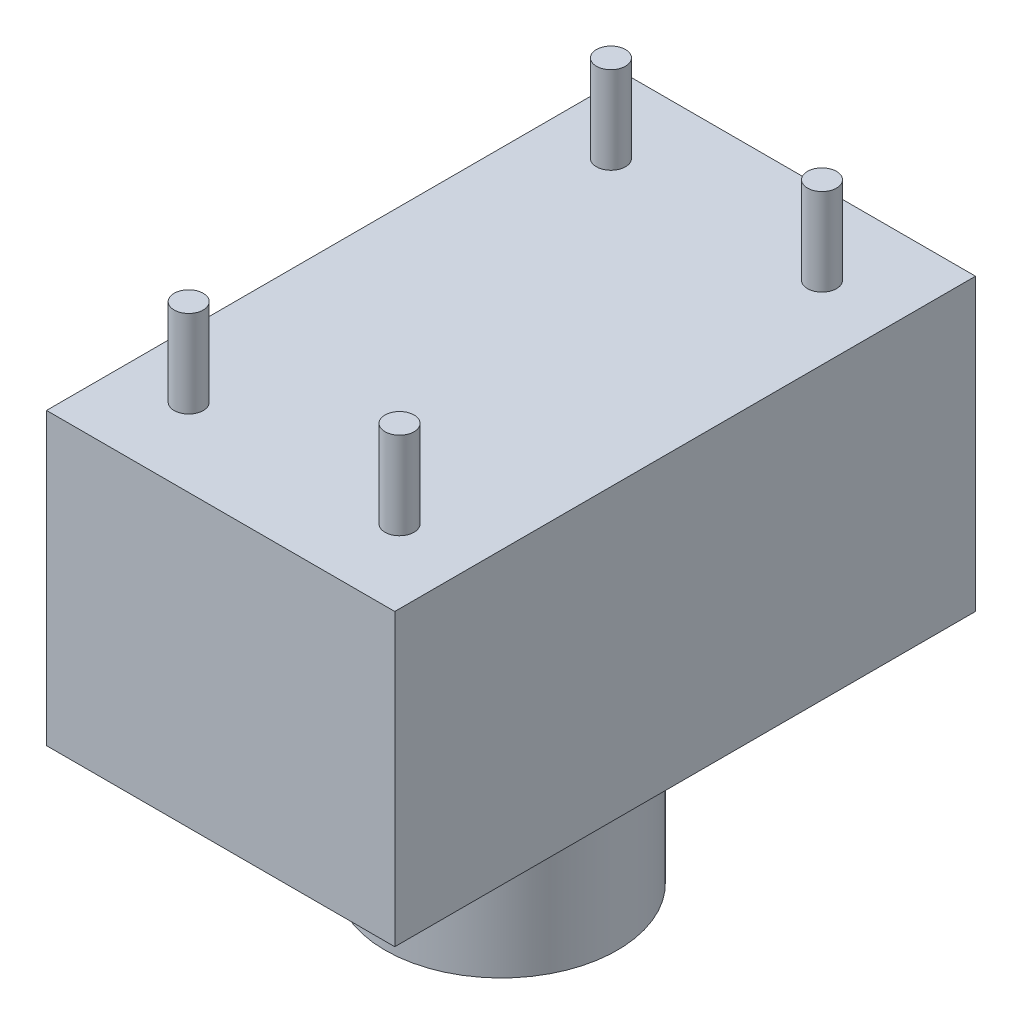
ISO-10303-21;
HEADER;
FILE_DESCRIPTION(('STEP AP214'),'2;1');
FILE_NAME('part.step','',(''),(''),'','','');
FILE_SCHEMA(('AUTOMOTIVE_DESIGN { 1 0 10303 214 1 1 1 1 }'));
ENDSEC;
DATA;
#1=APPLICATION_CONTEXT('core data for automotive mechanical design processes');
#2=APPLICATION_PROTOCOL_DEFINITION('international standard','automotive_design',2000,#1);
#3=PRODUCT_CONTEXT('',#1,'mechanical');
#4=PRODUCT('Part','Part','',(#3));
#5=PRODUCT_RELATED_PRODUCT_CATEGORY('part','',(#4));
#6=PRODUCT_DEFINITION_FORMATION('','',#4);
#7=PRODUCT_DEFINITION_CONTEXT('part definition',#1,'design');
#8=PRODUCT_DEFINITION('design','',#6,#7);
#9=PRODUCT_DEFINITION_SHAPE('','',#8);
#10=(LENGTH_UNIT() NAMED_UNIT(*) SI_UNIT(.MILLI.,.METRE.));
#11=(NAMED_UNIT(*) PLANE_ANGLE_UNIT() SI_UNIT($,.RADIAN.));
#12=(NAMED_UNIT(*) SI_UNIT($,.STERADIAN.) SOLID_ANGLE_UNIT());
#13=UNCERTAINTY_MEASURE_WITH_UNIT(LENGTH_MEASURE(1.E-05),#10,'distance_accuracy_value','');
#14=(GEOMETRIC_REPRESENTATION_CONTEXT(3) GLOBAL_UNCERTAINTY_ASSIGNED_CONTEXT((#13)) GLOBAL_UNIT_ASSIGNED_CONTEXT((#10,
#11,#12)) REPRESENTATION_CONTEXT('',''));
#15=CARTESIAN_POINT('',(0.,0.,0.));
#16=DIRECTION('',(0.,0.,1.));
#17=DIRECTION('',(1.,0.,0.));
#18=AXIS2_PLACEMENT_3D('',#15,#16,#17);
#19=CARTESIAN_POINT('',(-92.2157420391829,-9.9999999997477E-05,-37.9860384715509));
#20=DIRECTION('',(-1.,0.,0.));
#21=DIRECTION('',(0.,0.,1.));
#22=AXIS2_PLACEMENT_3D('',#19,#20,#21);
#23=PLANE('',#22);
#24=DIRECTION('',(0.,1.,0.));
#25=VECTOR('',#24,1.);
#26=CARTESIAN_POINT('',(-92.2157420391829,-9.9999999997477E-05,-17.9860384715509));
#27=LINE('',#26,#25);
#28=CARTESIAN_POINT('',(-92.2157420391829,-9.9999999997477E-05,-17.9860384715509));
#29=VERTEX_POINT('',#28);
#30=CARTESIAN_POINT('',(-92.2157420391829,10.,-17.9860384715509));
#31=VERTEX_POINT('',#30);
#32=EDGE_CURVE('E81',#29,#31,#27,.T.);
#33=ORIENTED_EDGE('',*,*,#32,.T.);
#34=DIRECTION('',(0.,0.,1.));
#35=VECTOR('',#34,1.);
#36=CARTESIAN_POINT('',(-92.2157420391829,10.,-37.9860384715509));
#37=LINE('',#36,#35);
#38=CARTESIAN_POINT('',(-92.2157420391829,10.,-37.9860384715509));
#39=VERTEX_POINT('',#38);
#40=EDGE_CURVE('E84',#39,#31,#37,.T.);
#41=ORIENTED_EDGE('',*,*,#40,.F.);
#42=DIRECTION('',(0.,1.,0.));
#43=VECTOR('',#42,1.);
#44=CARTESIAN_POINT('',(-92.2157420391829,-9.9999999997477E-05,-37.9860384715509));
#45=LINE('',#44,#43);
#46=CARTESIAN_POINT('',(-92.2157420391829,-9.9999999997477E-05,-37.9860384715509));
#47=VERTEX_POINT('',#46);
#48=EDGE_CURVE('E11',#47,#39,#45,.T.);
#49=ORIENTED_EDGE('',*,*,#48,.F.);
#50=DIRECTION('',(0.,0.,1.));
#51=VECTOR('',#50,1.);
#52=CARTESIAN_POINT('',(-92.2157420391829,-9.9999999997477E-05,-37.9860384715509));
#53=LINE('',#52,#51);
#54=EDGE_CURVE('E86',#47,#29,#53,.T.);
#55=ORIENTED_EDGE('',*,*,#54,.T.);
#56=EDGE_LOOP('',(#33,#41,#49,#55));
#57=FACE_BOUND('',#56,.T.);
#58=ADVANCED_FACE('F43',(#57),#23,.T.);
#59=CARTESIAN_POINT('',(-92.2157420391829,-9.9999999997477E-05,-37.9860384715509));
#60=DIRECTION('',(0.,0.,1.));
#61=DIRECTION('',(1.,0.,0.));
#62=AXIS2_PLACEMENT_3D('',#59,#60,#61);
#63=PLANE('',#62);
#64=ORIENTED_EDGE('',*,*,#48,.T.);
#65=DIRECTION('',(1.,0.,0.));
#66=VECTOR('',#65,1.);
#67=CARTESIAN_POINT('',(-92.2157420391829,10.,-37.9860384715509));
#68=LINE('',#67,#66);
#69=CARTESIAN_POINT('',(-80.2222915990285,10.,-37.9860384715509));
#70=VERTEX_POINT('',#69);
#71=EDGE_CURVE('E102',#39,#70,#68,.T.);
#72=ORIENTED_EDGE('',*,*,#71,.T.);
#73=DIRECTION('',(0.,1.,0.));
#74=VECTOR('',#73,1.);
#75=CARTESIAN_POINT('',(-80.2222915990285,-9.9999999997477E-05,-37.9860384715509));
#76=LINE('',#75,#74);
#77=CARTESIAN_POINT('',(-80.2222915990285,-9.9999999997477E-05,-37.9860384715509));
#78=VERTEX_POINT('',#77);
#79=EDGE_CURVE('E51',#78,#70,#76,.T.);
#80=ORIENTED_EDGE('',*,*,#79,.F.);
#81=DIRECTION('',(1.,0.,0.));
#82=VECTOR('',#81,1.);
#83=CARTESIAN_POINT('',(-92.2157420391829,-9.9999999997477E-05,-37.9860384715509));
#84=LINE('',#83,#82);
#85=EDGE_CURVE('E64',#47,#78,#84,.T.);
#86=ORIENTED_EDGE('',*,*,#85,.F.);
#87=EDGE_LOOP('',(#64,#72,#80,#86));
#88=FACE_BOUND('',#87,.T.);
#89=ADVANCED_FACE('F122',(#88),#63,.F.);
#90=CARTESIAN_POINT('',(-80.2222915990285,-9.9999999997477E-05,-37.9860384715509));
#91=DIRECTION('',(-1.,0.,0.));
#92=DIRECTION('',(0.,0.,1.));
#93=AXIS2_PLACEMENT_3D('',#90,#91,#92);
#94=PLANE('',#93);
#95=ORIENTED_EDGE('',*,*,#79,.T.);
#96=DIRECTION('',(0.,0.,1.));
#97=VECTOR('',#96,1.);
#98=CARTESIAN_POINT('',(-80.2222915990285,10.,-37.9860384715509));
#99=LINE('',#98,#97);
#100=CARTESIAN_POINT('',(-80.2222915990285,10.,-17.9860384715509));
#101=VERTEX_POINT('',#100);
#102=EDGE_CURVE('E98',#70,#101,#99,.T.);
#103=ORIENTED_EDGE('',*,*,#102,.T.);
#104=DIRECTION('',(0.,1.,0.));
#105=VECTOR('',#104,1.);
#106=CARTESIAN_POINT('',(-80.2222915990285,-9.9999999997477E-05,-17.9860384715509));
#107=LINE('',#106,#105);
#108=CARTESIAN_POINT('',(-80.2222915990285,-9.9999999997477E-05,-17.9860384715509));
#109=VERTEX_POINT('',#108);
#110=EDGE_CURVE('E90',#109,#101,#107,.T.);
#111=ORIENTED_EDGE('',*,*,#110,.F.);
#112=DIRECTION('',(0.,0.,1.));
#113=VECTOR('',#112,1.);
#114=CARTESIAN_POINT('',(-80.2222915990285,-9.9999999997477E-05,-37.9860384715509));
#115=LINE('',#114,#113);
#116=EDGE_CURVE('E114',#78,#109,#115,.T.);
#117=ORIENTED_EDGE('',*,*,#116,.F.);
#118=EDGE_LOOP('',(#95,#103,#111,#117));
#119=FACE_BOUND('',#118,.T.);
#120=ADVANCED_FACE('F120',(#119),#94,.F.);
#121=CARTESIAN_POINT('',(-92.2157420391829,-9.9999999997477E-05,-17.9860384715509));
#122=DIRECTION('',(0.,0.,1.));
#123=DIRECTION('',(1.,0.,0.));
#124=AXIS2_PLACEMENT_3D('',#121,#122,#123);
#125=PLANE('',#124);
#126=ORIENTED_EDGE('',*,*,#110,.T.);
#127=DIRECTION('',(1.,0.,0.));
#128=VECTOR('',#127,1.);
#129=CARTESIAN_POINT('',(-92.2157420391829,10.,-17.9860384715509));
#130=LINE('',#129,#128);
#131=EDGE_CURVE('E92',#31,#101,#130,.T.);
#132=ORIENTED_EDGE('',*,*,#131,.F.);
#133=ORIENTED_EDGE('',*,*,#32,.F.);
#134=DIRECTION('',(1.,0.,0.));
#135=VECTOR('',#134,1.);
#136=CARTESIAN_POINT('',(-92.2157420391829,-9.9999999997477E-05,-17.9860384715509));
#137=LINE('',#136,#135);
#138=EDGE_CURVE('E112',#29,#109,#137,.T.);
#139=ORIENTED_EDGE('',*,*,#138,.T.);
#140=EDGE_LOOP('',(#126,#132,#133,#139));
#141=FACE_BOUND('',#140,.T.);
#142=ADVANCED_FACE('F93',(#141),#125,.T.);
#143=CARTESIAN_POINT('',(0.,-9.9999999997477E-05,0.));
#144=DIRECTION('',(0.,1.,0.));
#145=DIRECTION('',(0.,0.,1.));
#146=AXIS2_PLACEMENT_3D('',#143,#144,#145);
#147=PLANE('',#146);
#148=CARTESIAN_POINT('',(-86.2844435726161,-9.99999999976714E-05,-27.7142659154837));
#149=DIRECTION('',(0.,1.,0.));
#150=DIRECTION('',(0.,0.,1.));
#151=AXIS2_PLACEMENT_3D('',#148,#149,#150);
#152=CIRCLE('',#151,4.00000000000001);
#153=CARTESIAN_POINT('',(-86.2844435726161,-9.99999999976714E-05,-23.7142659154837));
#154=VERTEX_POINT('',#153);
#155=EDGE_CURVE('E46',#154,#154,#152,.T.);
#156=ORIENTED_EDGE('',*,*,#155,.T.);
#157=EDGE_LOOP('',(#156));
#158=FACE_BOUND('',#157,.T.);
#159=ORIENTED_EDGE('',*,*,#54,.F.);
#160=ORIENTED_EDGE('',*,*,#85,.T.);
#161=ORIENTED_EDGE('',*,*,#116,.T.);
#162=ORIENTED_EDGE('',*,*,#138,.F.);
#163=EDGE_LOOP('',(#159,#160,#161,#162));
#164=FACE_BOUND('',#163,.T.);
#165=ADVANCED_FACE('F123',(#158,#164),#147,.F.);
#166=CARTESIAN_POINT('',(0.,10.,0.));
#167=DIRECTION('',(0.,1.,0.));
#168=DIRECTION('',(0.,0.,1.));
#169=AXIS2_PLACEMENT_3D('',#166,#167,#168);
#170=PLANE('',#169);
#171=CARTESIAN_POINT('',(-90.0117297231505,10.,-20.6792261606793));
#172=DIRECTION('',(0.,1.,0.));
#173=DIRECTION('',(0.,0.,1.));
#174=AXIS2_PLACEMENT_3D('',#171,#172,#173);
#175=CIRCLE('',#174,0.499999999999999);
#176=CARTESIAN_POINT('',(-90.0117297231505,10.,-20.1792261606793));
#177=VERTEX_POINT('',#176);
#178=EDGE_CURVE('E307',#177,#177,#175,.T.);
#179=ORIENTED_EDGE('',*,*,#178,.F.);
#180=EDGE_LOOP('',(#179));
#181=FACE_BOUND('',#180,.T.);
#182=CARTESIAN_POINT('',(-82.7512720387642,10.,-20.6792261607036));
#183=DIRECTION('',(0.,1.,0.));
#184=DIRECTION('',(0.,0.,1.));
#185=AXIS2_PLACEMENT_3D('',#182,#183,#184);
#186=CIRCLE('',#185,0.499999999999999);
#187=CARTESIAN_POINT('',(-82.7512720387642,10.,-20.1792261607036));
#188=VERTEX_POINT('',#187);
#189=EDGE_CURVE('E313',#188,#188,#186,.T.);
#190=ORIENTED_EDGE('',*,*,#189,.F.);
#191=EDGE_LOOP('',(#190));
#192=FACE_BOUND('',#191,.T.);
#193=CARTESIAN_POINT('',(-82.7422306575712,10.,-35.2206847349323));
#194=DIRECTION('',(0.,1.,0.));
#195=DIRECTION('',(0.,0.,1.));
#196=AXIS2_PLACEMENT_3D('',#193,#194,#195);
#197=CIRCLE('',#196,0.499999999999999);
#198=CARTESIAN_POINT('',(-82.7422306575712,10.,-34.7206847349323));
#199=VERTEX_POINT('',#198);
#200=EDGE_CURVE('E319',#199,#199,#197,.T.);
#201=ORIENTED_EDGE('',*,*,#200,.F.);
#202=EDGE_LOOP('',(#201));
#203=FACE_BOUND('',#202,.T.);
#204=CARTESIAN_POINT('',(-90.0117297231505,10.,-35.2206847349078));
#205=DIRECTION('',(0.,1.,0.));
#206=DIRECTION('',(0.,0.,1.));
#207=AXIS2_PLACEMENT_3D('',#204,#205,#206);
#208=CIRCLE('',#207,0.499999999999999);
#209=CARTESIAN_POINT('',(-90.0117297231505,10.,-34.7206847349078));
#210=VERTEX_POINT('',#209);
#211=EDGE_CURVE('E322',#210,#210,#208,.T.);
#212=ORIENTED_EDGE('',*,*,#211,.F.);
#213=EDGE_LOOP('',(#212));
#214=FACE_BOUND('',#213,.T.);
#215=ORIENTED_EDGE('',*,*,#40,.T.);
#216=ORIENTED_EDGE('',*,*,#131,.T.);
#217=ORIENTED_EDGE('',*,*,#102,.F.);
#218=ORIENTED_EDGE('',*,*,#71,.F.);
#219=EDGE_LOOP('',(#215,#216,#217,#218));
#220=FACE_BOUND('',#219,.T.);
#221=ADVANCED_FACE('F100',(#181,#192,#203,#214,#220),#170,.T.);
#222=CARTESIAN_POINT('',(-86.2844435726161,-6.,-27.7142659154837));
#223=DIRECTION('',(0.,1.,0.));
#224=DIRECTION('',(0.,0.,1.));
#225=AXIS2_PLACEMENT_3D('',#222,#223,#224);
#226=CYLINDRICAL_SURFACE('',#225,4.00000000000001);
#227=CARTESIAN_POINT('',(-86.2844435726161,-6.,-27.7142659154837));
#228=DIRECTION('',(0.,1.,0.));
#229=DIRECTION('',(0.,0.,1.));
#230=AXIS2_PLACEMENT_3D('',#227,#228,#229);
#231=CIRCLE('',#230,4.00000000000001);
#232=CARTESIAN_POINT('',(-86.2844435726161,-6.,-23.7142659154837));
#233=VERTEX_POINT('',#232);
#234=EDGE_CURVE('E105',#233,#233,#231,.T.);
#235=ORIENTED_EDGE('',*,*,#234,.T.);
#236=EDGE_LOOP('',(#235));
#237=FACE_BOUND('',#236,.T.);
#238=ORIENTED_EDGE('',*,*,#155,.F.);
#239=EDGE_LOOP('',(#238));
#240=FACE_BOUND('',#239,.T.);
#241=ADVANCED_FACE('F131',(#237,#240),#226,.T.);
#242=CARTESIAN_POINT('',(-86.2844435726161,-6.,-27.7142659154837));
#243=DIRECTION('',(0.,1.,0.));
#244=DIRECTION('',(0.,0.,1.));
#245=AXIS2_PLACEMENT_3D('',#242,#243,#244);
#246=PLANE('',#245);
#247=ORIENTED_EDGE('',*,*,#234,.F.);
#248=EDGE_LOOP('',(#247));
#249=FACE_BOUND('',#248,.T.);
#250=ADVANCED_FACE('F165',(#249),#246,.F.);
#251=CARTESIAN_POINT('',(-90.0117297231505,13.,-35.2206847349078));
#252=DIRECTION('',(0.,-1.,0.));
#253=DIRECTION('',(0.,0.,-1.));
#254=AXIS2_PLACEMENT_3D('',#251,#252,#253);
#255=CYLINDRICAL_SURFACE('',#254,0.499999999999999);
#256=CARTESIAN_POINT('',(-90.0117297231505,13.,-35.2206847349078));
#257=DIRECTION('',(0.,1.,0.));
#258=DIRECTION('',(0.,0.,1.));
#259=AXIS2_PLACEMENT_3D('',#256,#257,#258);
#260=CIRCLE('',#259,0.499999999999999);
#261=CARTESIAN_POINT('',(-90.0117297231505,13.,-34.7206847349078));
#262=VERTEX_POINT('',#261);
#263=EDGE_CURVE('E325',#262,#262,#260,.T.);
#264=ORIENTED_EDGE('',*,*,#263,.F.);
#265=EDGE_LOOP('',(#264));
#266=FACE_BOUND('',#265,.T.);
#267=ORIENTED_EDGE('',*,*,#211,.T.);
#268=EDGE_LOOP('',(#267));
#269=FACE_BOUND('',#268,.T.);
#270=ADVANCED_FACE('F176',(#266,#269),#255,.T.);
#271=CARTESIAN_POINT('',(-90.0117297231505,13.,-35.2206847349078));
#272=DIRECTION('',(0.,1.,0.));
#273=DIRECTION('',(0.,0.,1.));
#274=AXIS2_PLACEMENT_3D('',#271,#272,#273);
#275=PLANE('',#274);
#276=ORIENTED_EDGE('',*,*,#263,.T.);
#277=EDGE_LOOP('',(#276));
#278=FACE_BOUND('',#277,.T.);
#279=ADVANCED_FACE('F193',(#278),#275,.T.);
#280=CARTESIAN_POINT('',(-82.7422306575712,13.,-35.2206847349323));
#281=DIRECTION('',(0.,-1.,0.));
#282=DIRECTION('',(0.,0.,-1.));
#283=AXIS2_PLACEMENT_3D('',#280,#281,#282);
#284=CYLINDRICAL_SURFACE('',#283,0.499999999999999);
#285=CARTESIAN_POINT('',(-82.7422306575712,13.,-35.2206847349323));
#286=DIRECTION('',(0.,1.,0.));
#287=DIRECTION('',(0.,0.,1.));
#288=AXIS2_PLACEMENT_3D('',#285,#286,#287);
#289=CIRCLE('',#288,0.499999999999999);
#290=CARTESIAN_POINT('',(-82.7422306575712,13.,-34.7206847349323));
#291=VERTEX_POINT('',#290);
#292=EDGE_CURVE('E316',#291,#291,#289,.T.);
#293=ORIENTED_EDGE('',*,*,#292,.F.);
#294=EDGE_LOOP('',(#293));
#295=FACE_BOUND('',#294,.T.);
#296=ORIENTED_EDGE('',*,*,#200,.T.);
#297=EDGE_LOOP('',(#296));
#298=FACE_BOUND('',#297,.T.);
#299=ADVANCED_FACE('F204',(#295,#298),#284,.T.);
#300=CARTESIAN_POINT('',(-82.7422306575712,13.,-35.2206847349323));
#301=DIRECTION('',(0.,1.,0.));
#302=DIRECTION('',(0.,0.,1.));
#303=AXIS2_PLACEMENT_3D('',#300,#301,#302);
#304=PLANE('',#303);
#305=ORIENTED_EDGE('',*,*,#292,.T.);
#306=EDGE_LOOP('',(#305));
#307=FACE_BOUND('',#306,.T.);
#308=ADVANCED_FACE('F215',(#307),#304,.T.);
#309=CARTESIAN_POINT('',(-82.7512720387642,13.,-20.6792261607036));
#310=DIRECTION('',(0.,-1.,0.));
#311=DIRECTION('',(0.,0.,-1.));
#312=AXIS2_PLACEMENT_3D('',#309,#310,#311);
#313=CYLINDRICAL_SURFACE('',#312,0.499999999999999);
#314=CARTESIAN_POINT('',(-82.7512720387642,13.,-20.6792261607036));
#315=DIRECTION('',(0.,1.,0.));
#316=DIRECTION('',(0.,0.,1.));
#317=AXIS2_PLACEMENT_3D('',#314,#315,#316);
#318=CIRCLE('',#317,0.499999999999999);
#319=CARTESIAN_POINT('',(-82.7512720387642,13.,-20.1792261607036));
#320=VERTEX_POINT('',#319);
#321=EDGE_CURVE('E310',#320,#320,#318,.T.);
#322=ORIENTED_EDGE('',*,*,#321,.F.);
#323=EDGE_LOOP('',(#322));
#324=FACE_BOUND('',#323,.T.);
#325=ORIENTED_EDGE('',*,*,#189,.T.);
#326=EDGE_LOOP('',(#325));
#327=FACE_BOUND('',#326,.T.);
#328=ADVANCED_FACE('F226',(#324,#327),#313,.T.);
#329=CARTESIAN_POINT('',(-82.7512720387642,13.,-20.6792261607036));
#330=DIRECTION('',(0.,1.,0.));
#331=DIRECTION('',(0.,0.,1.));
#332=AXIS2_PLACEMENT_3D('',#329,#330,#331);
#333=PLANE('',#332);
#334=ORIENTED_EDGE('',*,*,#321,.T.);
#335=EDGE_LOOP('',(#334));
#336=FACE_BOUND('',#335,.T.);
#337=ADVANCED_FACE('F237',(#336),#333,.T.);
#338=CARTESIAN_POINT('',(-90.0117297231505,13.,-20.6792261606793));
#339=DIRECTION('',(0.,-1.,0.));
#340=DIRECTION('',(0.,0.,-1.));
#341=AXIS2_PLACEMENT_3D('',#338,#339,#340);
#342=CYLINDRICAL_SURFACE('',#341,0.499999999999999);
#343=CARTESIAN_POINT('',(-90.0117297231505,13.,-20.6792261606793));
#344=DIRECTION('',(0.,1.,0.));
#345=DIRECTION('',(0.,0.,1.));
#346=AXIS2_PLACEMENT_3D('',#343,#344,#345);
#347=CIRCLE('',#346,0.499999999999999);
#348=CARTESIAN_POINT('',(-90.0117297231505,13.,-20.1792261606793));
#349=VERTEX_POINT('',#348);
#350=EDGE_CURVE('E306',#349,#349,#347,.T.);
#351=ORIENTED_EDGE('',*,*,#350,.F.);
#352=EDGE_LOOP('',(#351));
#353=FACE_BOUND('',#352,.T.);
#354=ORIENTED_EDGE('',*,*,#178,.T.);
#355=EDGE_LOOP('',(#354));
#356=FACE_BOUND('',#355,.T.);
#357=ADVANCED_FACE('F248',(#353,#356),#342,.T.);
#358=CARTESIAN_POINT('',(-90.0117297231505,13.,-20.6792261606793));
#359=DIRECTION('',(0.,1.,0.));
#360=DIRECTION('',(0.,0.,1.));
#361=AXIS2_PLACEMENT_3D('',#358,#359,#360);
#362=PLANE('',#361);
#363=ORIENTED_EDGE('',*,*,#350,.T.);
#364=EDGE_LOOP('',(#363));
#365=FACE_BOUND('',#364,.T.);
#366=ADVANCED_FACE('F259',(#365),#362,.T.);
#367=CLOSED_SHELL('',(#58,#89,#120,#142,#165,#221,#241,#250,#270,#279,#299,#308,#328,#337,#357,#366));
#368=MANIFOLD_SOLID_BREP('B2',#367);
#369=ADVANCED_BREP_SHAPE_REPRESENTATION('',(#18,#368),#14);
#370=SHAPE_DEFINITION_REPRESENTATION(#9,#369);
ENDSEC;
END-ISO-10303-21;
